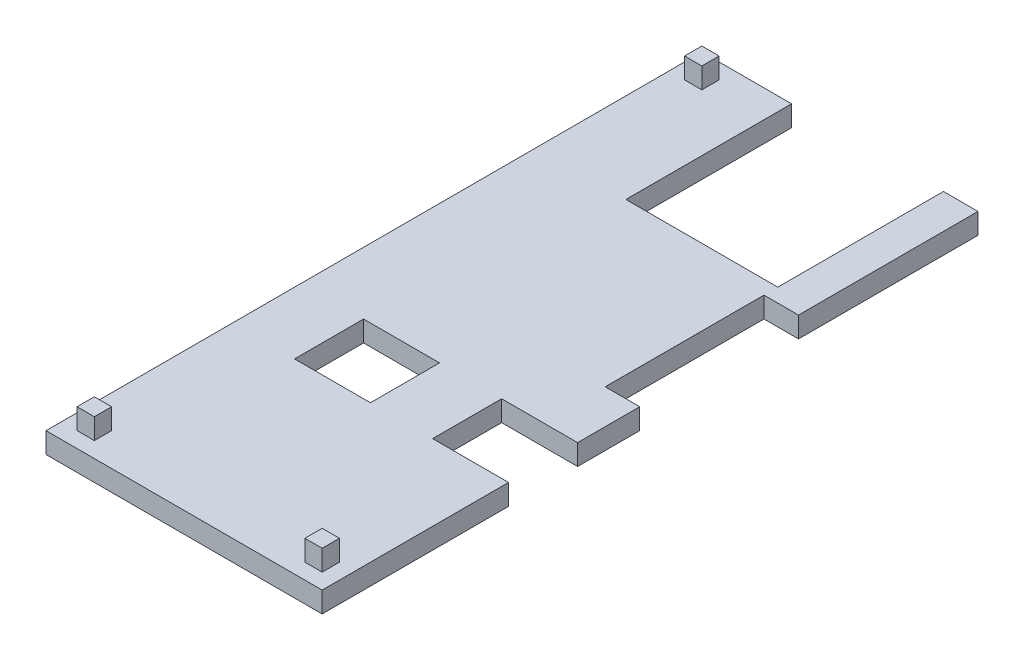
ISO-10303-21;
HEADER;
FILE_DESCRIPTION(('STEP AP214'),'2;1');
FILE_NAME('part.step','',(''),(''),'','','');
FILE_SCHEMA(('AUTOMOTIVE_DESIGN { 1 0 10303 214 1 1 1 1 }'));
ENDSEC;
DATA;
#1=APPLICATION_CONTEXT('core data for automotive mechanical design processes');
#2=APPLICATION_PROTOCOL_DEFINITION('international standard','automotive_design',2000,#1);
#3=PRODUCT_CONTEXT('',#1,'mechanical');
#4=PRODUCT('Part','Part','',(#3));
#5=PRODUCT_RELATED_PRODUCT_CATEGORY('part','',(#4));
#6=PRODUCT_DEFINITION_FORMATION('','',#4);
#7=PRODUCT_DEFINITION_CONTEXT('part definition',#1,'design');
#8=PRODUCT_DEFINITION('design','',#6,#7);
#9=PRODUCT_DEFINITION_SHAPE('','',#8);
#10=(LENGTH_UNIT() NAMED_UNIT(*) SI_UNIT(.MILLI.,.METRE.));
#11=(NAMED_UNIT(*) PLANE_ANGLE_UNIT() SI_UNIT($,.RADIAN.));
#12=(NAMED_UNIT(*) SI_UNIT($,.STERADIAN.) SOLID_ANGLE_UNIT());
#13=UNCERTAINTY_MEASURE_WITH_UNIT(LENGTH_MEASURE(1.E-05),#10,'distance_accuracy_value','');
#14=(GEOMETRIC_REPRESENTATION_CONTEXT(3) GLOBAL_UNCERTAINTY_ASSIGNED_CONTEXT((#13)) GLOBAL_UNIT_ASSIGNED_CONTEXT((#10,
#11,#12)) REPRESENTATION_CONTEXT('',''));
#15=CARTESIAN_POINT('',(0.,0.,0.));
#16=DIRECTION('',(0.,0.,1.));
#17=DIRECTION('',(1.,0.,0.));
#18=AXIS2_PLACEMENT_3D('',#15,#16,#17);
#19=CARTESIAN_POINT('',(0.,3.,0.));
#20=DIRECTION('',(0.,-1.,0.));
#21=DIRECTION('',(0.,0.,-1.));
#22=AXIS2_PLACEMENT_3D('',#19,#20,#21);
#23=PLANE('',#22);
#24=DIRECTION('',(0.,0.,-1.));
#25=VECTOR('',#24,1.);
#26=CARTESIAN_POINT('',(-20.,3.,0.));
#27=LINE('',#26,#25);
#28=CARTESIAN_POINT('',(-20.,3.,-27.));
#29=VERTEX_POINT('',#28);
#30=CARTESIAN_POINT('',(-20.,3.,-37.));
#31=VERTEX_POINT('',#30);
#32=EDGE_CURVE('E449',#29,#31,#27,.T.);
#33=ORIENTED_EDGE('',*,*,#32,.F.);
#34=DIRECTION('',(-1.,0.,0.));
#35=VECTOR('',#34,1.);
#36=CARTESIAN_POINT('',(0.,3.,-27.));
#37=LINE('',#36,#35);
#38=CARTESIAN_POINT('',(-31.,3.,-27.));
#39=VERTEX_POINT('',#38);
#40=EDGE_CURVE('E451',#29,#39,#37,.T.);
#41=ORIENTED_EDGE('',*,*,#40,.T.);
#42=DIRECTION('',(0.,0.,-1.));
#43=VECTOR('',#42,1.);
#44=CARTESIAN_POINT('',(-31.,3.,0.));
#45=LINE('',#44,#43);
#46=CARTESIAN_POINT('',(-31.,3.,-37.));
#47=VERTEX_POINT('',#46);
#48=EDGE_CURVE('E454',#39,#47,#45,.T.);
#49=ORIENTED_EDGE('',*,*,#48,.T.);
#50=DIRECTION('',(-1.,0.,0.));
#51=VECTOR('',#50,1.);
#52=CARTESIAN_POINT('',(0.,3.,-37.));
#53=LINE('',#52,#51);
#54=EDGE_CURVE('E457',#31,#47,#53,.T.);
#55=ORIENTED_EDGE('',*,*,#54,.F.);
#56=EDGE_LOOP('',(#33,#41,#49,#55));
#57=FACE_BOUND('',#56,.T.);
#58=DIRECTION('',(0.,0.,1.));
#59=VECTOR('',#58,1.);
#60=CARTESIAN_POINT('',(-37.75,3.,-4.75));
#61=LINE('',#60,#59);
#62=CARTESIAN_POINT('',(-37.75,3.,-4.75));
#63=VERTEX_POINT('',#62);
#64=CARTESIAN_POINT('',(-37.75,3.,-2.25));
#65=VERTEX_POINT('',#64);
#66=EDGE_CURVE('E352',#63,#65,#61,.T.);
#67=ORIENTED_EDGE('',*,*,#66,.F.);
#68=DIRECTION('',(-1.,0.,0.));
#69=VECTOR('',#68,1.);
#70=CARTESIAN_POINT('',(-37.75,3.,-4.75));
#71=LINE('',#70,#69);
#72=CARTESIAN_POINT('',(-35.25,3.,-4.75));
#73=VERTEX_POINT('',#72);
#74=EDGE_CURVE('E363',#73,#63,#71,.T.);
#75=ORIENTED_EDGE('',*,*,#74,.F.);
#76=DIRECTION('',(0.,0.,-1.));
#77=VECTOR('',#76,1.);
#78=CARTESIAN_POINT('',(-35.25,3.,-4.75));
#79=LINE('',#78,#77);
#80=CARTESIAN_POINT('',(-35.25,3.,-2.25));
#81=VERTEX_POINT('',#80);
#82=EDGE_CURVE('E376',#81,#73,#79,.T.);
#83=ORIENTED_EDGE('',*,*,#82,.F.);
#84=DIRECTION('',(1.,0.,0.));
#85=VECTOR('',#84,1.);
#86=CARTESIAN_POINT('',(-37.75,3.,-2.25));
#87=LINE('',#86,#85);
#88=EDGE_CURVE('E373',#65,#81,#87,.T.);
#89=ORIENTED_EDGE('',*,*,#88,.F.);
#90=EDGE_LOOP('',(#67,#75,#83,#89));
#91=FACE_BOUND('',#90,.T.);
#92=DIRECTION('',(0.,0.,1.));
#93=VECTOR('',#92,1.);
#94=CARTESIAN_POINT('',(-4.75,3.,-4.75));
#95=LINE('',#94,#93);
#96=CARTESIAN_POINT('',(-4.75,3.,-4.75));
#97=VERTEX_POINT('',#96);
#98=CARTESIAN_POINT('',(-4.75,3.,-2.25));
#99=VERTEX_POINT('',#98);
#100=EDGE_CURVE('E349',#97,#99,#95,.T.);
#101=ORIENTED_EDGE('',*,*,#100,.F.);
#102=DIRECTION('',(-1.,0.,0.));
#103=VECTOR('',#102,1.);
#104=CARTESIAN_POINT('',(-4.75,3.,-4.75));
#105=LINE('',#104,#103);
#106=CARTESIAN_POINT('',(-2.25,3.,-4.75));
#107=VERTEX_POINT('',#106);
#108=EDGE_CURVE('E339',#107,#97,#105,.T.);
#109=ORIENTED_EDGE('',*,*,#108,.F.);
#110=DIRECTION('',(0.,0.,-1.));
#111=VECTOR('',#110,1.);
#112=CARTESIAN_POINT('',(-2.25,3.,-4.75));
#113=LINE('',#112,#111);
#114=CARTESIAN_POINT('',(-2.25,3.,-2.25));
#115=VERTEX_POINT('',#114);
#116=EDGE_CURVE('E343',#115,#107,#113,.T.);
#117=ORIENTED_EDGE('',*,*,#116,.F.);
#118=DIRECTION('',(1.,0.,0.));
#119=VECTOR('',#118,1.);
#120=CARTESIAN_POINT('',(-4.75,3.,-2.25));
#121=LINE('',#120,#119);
#122=EDGE_CURVE('E346',#99,#115,#121,.T.);
#123=ORIENTED_EDGE('',*,*,#122,.F.);
#124=EDGE_LOOP('',(#101,#109,#117,#123));
#125=FACE_BOUND('',#124,.T.);
#126=DIRECTION('',(0.,0.,1.));
#127=VECTOR('',#126,1.);
#128=CARTESIAN_POINT('',(-37.75,3.,-90.25));
#129=LINE('',#128,#127);
#130=CARTESIAN_POINT('',(-37.75,3.,-92.75));
#131=VERTEX_POINT('',#130);
#132=CARTESIAN_POINT('',(-37.75,3.,-90.25));
#133=VERTEX_POINT('',#132);
#134=EDGE_CURVE('E392',#131,#133,#129,.T.);
#135=ORIENTED_EDGE('',*,*,#134,.F.);
#136=DIRECTION('',(-1.,0.,0.));
#137=VECTOR('',#136,1.);
#138=CARTESIAN_POINT('',(-37.75,3.,-92.75));
#139=LINE('',#138,#137);
#140=CARTESIAN_POINT('',(-35.25,3.,-92.75));
#141=VERTEX_POINT('',#140);
#142=EDGE_CURVE('E396',#141,#131,#139,.T.);
#143=ORIENTED_EDGE('',*,*,#142,.F.);
#144=DIRECTION('',(0.,0.,-1.));
#145=VECTOR('',#144,1.);
#146=CARTESIAN_POINT('',(-35.25,3.,-90.25));
#147=LINE('',#146,#145);
#148=CARTESIAN_POINT('',(-35.25,3.,-90.25));
#149=VERTEX_POINT('',#148);
#150=EDGE_CURVE('E409',#149,#141,#147,.T.);
#151=ORIENTED_EDGE('',*,*,#150,.F.);
#152=DIRECTION('',(1.,0.,0.));
#153=VECTOR('',#152,1.);
#154=CARTESIAN_POINT('',(-37.75,3.,-90.25));
#155=LINE('',#154,#153);
#156=EDGE_CURVE('E406',#133,#149,#155,.T.);
#157=ORIENTED_EDGE('',*,*,#156,.F.);
#158=EDGE_LOOP('',(#135,#143,#151,#157));
#159=FACE_BOUND('',#158,.T.);
#160=DIRECTION('',(0.,0.,-1.));
#161=VECTOR('',#160,1.);
#162=CARTESIAN_POINT('',(-4.99999999999999,3.,0.));
#163=LINE('',#162,#161);
#164=CARTESIAN_POINT('',(-5.,3.,-71.));
#165=VERTEX_POINT('',#164);
#166=CARTESIAN_POINT('',(-5.,3.,-95.));
#167=VERTEX_POINT('',#166);
#168=EDGE_CURVE('E253',#165,#167,#163,.T.);
#169=ORIENTED_EDGE('',*,*,#168,.F.);
#170=DIRECTION('',(-1.,0.,0.));
#171=VECTOR('',#170,1.);
#172=CARTESIAN_POINT('',(0.,3.,-71.));
#173=LINE('',#172,#171);
#174=CARTESIAN_POINT('',(-27.,3.,-71.));
#175=VERTEX_POINT('',#174);
#176=EDGE_CURVE('E426',#165,#175,#173,.T.);
#177=ORIENTED_EDGE('',*,*,#176,.T.);
#178=DIRECTION('',(0.,0.,-1.));
#179=VECTOR('',#178,1.);
#180=CARTESIAN_POINT('',(-27.,3.,0.));
#181=LINE('',#180,#179);
#182=CARTESIAN_POINT('',(-27.,3.,-95.));
#183=VERTEX_POINT('',#182);
#184=EDGE_CURVE('E429',#175,#183,#181,.T.);
#185=ORIENTED_EDGE('',*,*,#184,.T.);
#186=DIRECTION('',(-1.,0.,0.));
#187=VECTOR('',#186,1.);
#188=CARTESIAN_POINT('',(0.,3.,-95.));
#189=LINE('',#188,#187);
#190=CARTESIAN_POINT('',(-40.,3.,-95.));
#191=VERTEX_POINT('',#190);
#192=EDGE_CURVE('E290',#183,#191,#189,.T.);
#193=ORIENTED_EDGE('',*,*,#192,.T.);
#194=DIRECTION('',(0.,0.,-1.));
#195=VECTOR('',#194,1.);
#196=CARTESIAN_POINT('',(-40.,3.,0.));
#197=LINE('',#196,#195);
#198=CARTESIAN_POINT('',(-40.,3.,0.));
#199=VERTEX_POINT('',#198);
#200=EDGE_CURVE('E322',#199,#191,#197,.T.);
#201=ORIENTED_EDGE('',*,*,#200,.F.);
#202=DIRECTION('',(-1.,0.,0.));
#203=VECTOR('',#202,1.);
#204=CARTESIAN_POINT('',(0.,3.,0.));
#205=LINE('',#204,#203);
#206=CARTESIAN_POINT('',(0.,3.,0.));
#207=VERTEX_POINT('',#206);
#208=EDGE_CURVE('E300',#207,#199,#205,.T.);
#209=ORIENTED_EDGE('',*,*,#208,.F.);
#210=DIRECTION('',(0.,0.,-1.));
#211=VECTOR('',#210,1.);
#212=CARTESIAN_POINT('',(0.,3.,0.));
#213=LINE('',#212,#211);
#214=CARTESIAN_POINT('',(0.,3.,-27.));
#215=VERTEX_POINT('',#214);
#216=EDGE_CURVE('E281',#207,#215,#213,.T.);
#217=ORIENTED_EDGE('',*,*,#216,.T.);
#218=DIRECTION('',(1.,0.,0.));
#219=VECTOR('',#218,1.);
#220=CARTESIAN_POINT('',(0.,3.,-27.));
#221=LINE('',#220,#219);
#222=CARTESIAN_POINT('',(-11.,3.,-27.));
#223=VERTEX_POINT('',#222);
#224=EDGE_CURVE('E444',#223,#215,#221,.T.);
#225=ORIENTED_EDGE('',*,*,#224,.F.);
#226=DIRECTION('',(0.,0.,-1.));
#227=VECTOR('',#226,1.);
#228=CARTESIAN_POINT('',(-11.,3.,0.));
#229=LINE('',#228,#227);
#230=CARTESIAN_POINT('',(-11.,3.,-37.));
#231=VERTEX_POINT('',#230);
#232=EDGE_CURVE('E446',#223,#231,#229,.T.);
#233=ORIENTED_EDGE('',*,*,#232,.T.);
#234=DIRECTION('',(1.,0.,0.));
#235=VECTOR('',#234,1.);
#236=CARTESIAN_POINT('',(0.,3.,-37.));
#237=LINE('',#236,#235);
#238=CARTESIAN_POINT('',(0.,3.,-37.));
#239=VERTEX_POINT('',#238);
#240=EDGE_CURVE('E441',#231,#239,#237,.T.);
#241=ORIENTED_EDGE('',*,*,#240,.T.);
#242=CARTESIAN_POINT('',(0.,3.,-46.));
#243=VERTEX_POINT('',#242);
#244=EDGE_CURVE('E320',#239,#243,#213,.T.);
#245=ORIENTED_EDGE('',*,*,#244,.T.);
#246=DIRECTION('',(-1.,0.,0.));
#247=VECTOR('',#246,1.);
#248=CARTESIAN_POINT('',(0.,3.,-46.));
#249=LINE('',#248,#247);
#250=CARTESIAN_POINT('',(-5.,3.,-46.));
#251=VERTEX_POINT('',#250);
#252=EDGE_CURVE('E438',#243,#251,#249,.T.);
#253=ORIENTED_EDGE('',*,*,#252,.T.);
#254=DIRECTION('',(0.,0.,-1.));
#255=VECTOR('',#254,1.);
#256=CARTESIAN_POINT('',(-4.99999999999999,3.,0.));
#257=LINE('',#256,#255);
#258=CARTESIAN_POINT('',(-5.,3.,-69.));
#259=VERTEX_POINT('',#258);
#260=EDGE_CURVE('E432',#251,#259,#257,.T.);
#261=ORIENTED_EDGE('',*,*,#260,.T.);
#262=DIRECTION('',(1.,0.,0.));
#263=VECTOR('',#262,1.);
#264=CARTESIAN_POINT('',(0.,3.,-69.));
#265=LINE('',#264,#263);
#266=CARTESIAN_POINT('',(0.,3.,-69.));
#267=VERTEX_POINT('',#266);
#268=EDGE_CURVE('E435',#259,#267,#265,.T.);
#269=ORIENTED_EDGE('',*,*,#268,.T.);
#270=CARTESIAN_POINT('',(0.,3.,-95.));
#271=VERTEX_POINT('',#270);
#272=EDGE_CURVE('E321',#267,#271,#213,.T.);
#273=ORIENTED_EDGE('',*,*,#272,.T.);
#274=EDGE_CURVE('E323',#271,#167,#189,.T.);
#275=ORIENTED_EDGE('',*,*,#274,.T.);
#276=EDGE_LOOP('',(#169,#177,#185,#193,#201,#209,#217,#225,#233,#241,#245,#253,#261,#269,#273,#275));
#277=FACE_BOUND('',#276,.T.);
#278=ADVANCED_FACE('F37',(#57,#91,#125,#159,#277),#23,.F.);
#279=CARTESIAN_POINT('',(0.,3.,-95.));
#280=DIRECTION('',(0.,0.,1.));
#281=DIRECTION('',(1.,0.,0.));
#282=AXIS2_PLACEMENT_3D('',#279,#280,#281);
#283=PLANE('',#282);
#284=DIRECTION('',(0.,1.,0.));
#285=VECTOR('',#284,1.);
#286=CARTESIAN_POINT('',(-5.,0.,-95.));
#287=LINE('',#286,#285);
#288=CARTESIAN_POINT('',(-5.,0.,-95.));
#289=VERTEX_POINT('',#288);
#290=EDGE_CURVE('E247',#289,#167,#287,.T.);
#291=ORIENTED_EDGE('',*,*,#290,.T.);
#292=ORIENTED_EDGE('',*,*,#274,.F.);
#293=DIRECTION('',(0.,-1.,0.));
#294=VECTOR('',#293,1.);
#295=CARTESIAN_POINT('',(0.,3.,-95.));
#296=LINE('',#295,#294);
#297=CARTESIAN_POINT('',(0.,0.,-95.));
#298=VERTEX_POINT('',#297);
#299=EDGE_CURVE('E272',#271,#298,#296,.T.);
#300=ORIENTED_EDGE('',*,*,#299,.T.);
#301=DIRECTION('',(-1.,0.,0.));
#302=VECTOR('',#301,1.);
#303=CARTESIAN_POINT('',(0.,0.,-95.));
#304=LINE('',#303,#302);
#305=EDGE_CURVE('E264',#298,#289,#304,.T.);
#306=ORIENTED_EDGE('',*,*,#305,.T.);
#307=EDGE_LOOP('',(#291,#292,#300,#306));
#308=FACE_BOUND('',#307,.T.);
#309=ADVANCED_FACE('F270',(#308),#283,.F.);
#310=CARTESIAN_POINT('',(0.,3.,0.));
#311=DIRECTION('',(-1.,0.,0.));
#312=DIRECTION('',(0.,0.,1.));
#313=AXIS2_PLACEMENT_3D('',#310,#311,#312);
#314=PLANE('',#313);
#315=ORIENTED_EDGE('',*,*,#272,.F.);
#316=DIRECTION('',(0.,1.,0.));
#317=VECTOR('',#316,1.);
#318=CARTESIAN_POINT('',(0.,0.,-69.));
#319=LINE('',#318,#317);
#320=CARTESIAN_POINT('',(0.,0.,-69.));
#321=VERTEX_POINT('',#320);
#322=EDGE_CURVE('E503',#321,#267,#319,.T.);
#323=ORIENTED_EDGE('',*,*,#322,.F.);
#324=DIRECTION('',(0.,0.,-1.));
#325=VECTOR('',#324,1.);
#326=CARTESIAN_POINT('',(0.,0.,0.));
#327=LINE('',#326,#325);
#328=EDGE_CURVE('E286',#321,#298,#327,.T.);
#329=ORIENTED_EDGE('',*,*,#328,.T.);
#330=ORIENTED_EDGE('',*,*,#299,.F.);
#331=EDGE_LOOP('',(#315,#323,#329,#330));
#332=FACE_BOUND('',#331,.T.);
#333=ADVANCED_FACE('F528',(#332),#314,.F.);
#334=DIRECTION('',(0.,1.,0.));
#335=VECTOR('',#334,1.);
#336=CARTESIAN_POINT('',(0.,0.,-27.));
#337=LINE('',#336,#335);
#338=CARTESIAN_POINT('',(0.,0.,-27.));
#339=VERTEX_POINT('',#338);
#340=EDGE_CURVE('E316',#339,#215,#337,.T.);
#341=ORIENTED_EDGE('',*,*,#340,.T.);
#342=ORIENTED_EDGE('',*,*,#216,.F.);
#343=DIRECTION('',(0.,-1.,0.));
#344=VECTOR('',#343,1.);
#345=CARTESIAN_POINT('',(0.,3.,0.));
#346=LINE('',#345,#344);
#347=CARTESIAN_POINT('',(0.,0.,0.));
#348=VERTEX_POINT('',#347);
#349=EDGE_CURVE('E293',#207,#348,#346,.T.);
#350=ORIENTED_EDGE('',*,*,#349,.T.);
#351=EDGE_CURVE('E287',#348,#339,#327,.T.);
#352=ORIENTED_EDGE('',*,*,#351,.T.);
#353=EDGE_LOOP('',(#341,#342,#350,#352));
#354=FACE_BOUND('',#353,.T.);
#355=ADVANCED_FACE('F314',(#354),#314,.F.);
#356=CARTESIAN_POINT('',(0.,0.,0.));
#357=DIRECTION('',(0.,-1.,0.));
#358=DIRECTION('',(0.,0.,-1.));
#359=AXIS2_PLACEMENT_3D('',#356,#357,#358);
#360=PLANE('',#359);
#361=DIRECTION('',(1.,0.,0.));
#362=VECTOR('',#361,1.);
#363=CARTESIAN_POINT('',(0.,0.,-27.));
#364=LINE('',#363,#362);
#365=CARTESIAN_POINT('',(-31.,0.,-27.));
#366=VERTEX_POINT('',#365);
#367=CARTESIAN_POINT('',(-20.,0.,-27.));
#368=VERTEX_POINT('',#367);
#369=EDGE_CURVE('E462',#366,#368,#364,.T.);
#370=ORIENTED_EDGE('',*,*,#369,.T.);
#371=DIRECTION('',(0.,0.,1.));
#372=VECTOR('',#371,1.);
#373=CARTESIAN_POINT('',(-20.,0.,0.));
#374=LINE('',#373,#372);
#375=CARTESIAN_POINT('',(-20.,0.,-37.));
#376=VERTEX_POINT('',#375);
#377=EDGE_CURVE('E479',#376,#368,#374,.T.);
#378=ORIENTED_EDGE('',*,*,#377,.F.);
#379=DIRECTION('',(1.,0.,0.));
#380=VECTOR('',#379,1.);
#381=CARTESIAN_POINT('',(0.,0.,-37.));
#382=LINE('',#381,#380);
#383=CARTESIAN_POINT('',(-31.,0.,-37.));
#384=VERTEX_POINT('',#383);
#385=EDGE_CURVE('E477',#384,#376,#382,.T.);
#386=ORIENTED_EDGE('',*,*,#385,.F.);
#387=DIRECTION('',(0.,0.,1.));
#388=VECTOR('',#387,1.);
#389=CARTESIAN_POINT('',(-31.,0.,0.));
#390=LINE('',#389,#388);
#391=EDGE_CURVE('E474',#384,#366,#390,.T.);
#392=ORIENTED_EDGE('',*,*,#391,.T.);
#393=EDGE_LOOP('',(#370,#378,#386,#392));
#394=FACE_BOUND('',#393,.T.);
#395=DIRECTION('',(1.,0.,0.));
#396=VECTOR('',#395,1.);
#397=CARTESIAN_POINT('',(0.,0.,-71.));
#398=LINE('',#397,#396);
#399=CARTESIAN_POINT('',(-27.,0.,-71.));
#400=VERTEX_POINT('',#399);
#401=CARTESIAN_POINT('',(-5.,0.,-71.));
#402=VERTEX_POINT('',#401);
#403=EDGE_CURVE('E60',#400,#402,#398,.T.);
#404=ORIENTED_EDGE('',*,*,#403,.T.);
#405=DIRECTION('',(0.,0.,1.));
#406=VECTOR('',#405,1.);
#407=CARTESIAN_POINT('',(-4.99999999999999,0.,0.));
#408=LINE('',#407,#406);
#409=EDGE_CURVE('E251',#289,#402,#408,.T.);
#410=ORIENTED_EDGE('',*,*,#409,.F.);
#411=ORIENTED_EDGE('',*,*,#305,.F.);
#412=ORIENTED_EDGE('',*,*,#328,.F.);
#413=DIRECTION('',(-1.,0.,0.));
#414=VECTOR('',#413,1.);
#415=CARTESIAN_POINT('',(0.,0.,-69.));
#416=LINE('',#415,#414);
#417=CARTESIAN_POINT('',(-5.,0.,-69.));
#418=VERTEX_POINT('',#417);
#419=EDGE_CURVE('E500',#321,#418,#416,.T.);
#420=ORIENTED_EDGE('',*,*,#419,.T.);
#421=DIRECTION('',(0.,0.,1.));
#422=VECTOR('',#421,1.);
#423=CARTESIAN_POINT('',(-4.99999999999999,0.,0.));
#424=LINE('',#423,#422);
#425=CARTESIAN_POINT('',(-5.,0.,-46.));
#426=VERTEX_POINT('',#425);
#427=EDGE_CURVE('E490',#418,#426,#424,.T.);
#428=ORIENTED_EDGE('',*,*,#427,.T.);
#429=DIRECTION('',(1.,0.,0.));
#430=VECTOR('',#429,1.);
#431=CARTESIAN_POINT('',(0.,0.,-46.));
#432=LINE('',#431,#430);
#433=CARTESIAN_POINT('',(0.,0.,-46.));
#434=VERTEX_POINT('',#433);
#435=EDGE_CURVE('E509',#426,#434,#432,.T.);
#436=ORIENTED_EDGE('',*,*,#435,.T.);
#437=CARTESIAN_POINT('',(0.,0.,-37.));
#438=VERTEX_POINT('',#437);
#439=EDGE_CURVE('E291',#438,#434,#327,.T.);
#440=ORIENTED_EDGE('',*,*,#439,.F.);
#441=DIRECTION('',(-1.,0.,0.));
#442=VECTOR('',#441,1.);
#443=CARTESIAN_POINT('',(0.,0.,-37.));
#444=LINE('',#443,#442);
#445=CARTESIAN_POINT('',(-11.,0.,-37.));
#446=VERTEX_POINT('',#445);
#447=EDGE_CURVE('E471',#438,#446,#444,.T.);
#448=ORIENTED_EDGE('',*,*,#447,.T.);
#449=DIRECTION('',(0.,0.,1.));
#450=VECTOR('',#449,1.);
#451=CARTESIAN_POINT('',(-11.,0.,0.));
#452=LINE('',#451,#450);
#453=CARTESIAN_POINT('',(-11.,0.,-27.));
#454=VERTEX_POINT('',#453);
#455=EDGE_CURVE('E492',#446,#454,#452,.T.);
#456=ORIENTED_EDGE('',*,*,#455,.T.);
#457=DIRECTION('',(-1.,0.,0.));
#458=VECTOR('',#457,1.);
#459=CARTESIAN_POINT('',(0.,0.,-27.));
#460=LINE('',#459,#458);
#461=EDGE_CURVE('E311',#339,#454,#460,.T.);
#462=ORIENTED_EDGE('',*,*,#461,.F.);
#463=ORIENTED_EDGE('',*,*,#351,.F.);
#464=DIRECTION('',(-1.,0.,0.));
#465=VECTOR('',#464,1.);
#466=CARTESIAN_POINT('',(0.,0.,0.));
#467=LINE('',#466,#465);
#468=CARTESIAN_POINT('',(-40.,0.,0.));
#469=VERTEX_POINT('',#468);
#470=EDGE_CURVE('E277',#348,#469,#467,.T.);
#471=ORIENTED_EDGE('',*,*,#470,.T.);
#472=DIRECTION('',(0.,0.,-1.));
#473=VECTOR('',#472,1.);
#474=CARTESIAN_POINT('',(-40.,0.,0.));
#475=LINE('',#474,#473);
#476=CARTESIAN_POINT('',(-40.,0.,-95.));
#477=VERTEX_POINT('',#476);
#478=EDGE_CURVE('E273',#469,#477,#475,.T.);
#479=ORIENTED_EDGE('',*,*,#478,.T.);
#480=CARTESIAN_POINT('',(-27.,0.,-95.));
#481=VERTEX_POINT('',#480);
#482=EDGE_CURVE('E274',#481,#477,#304,.T.);
#483=ORIENTED_EDGE('',*,*,#482,.F.);
#484=DIRECTION('',(0.,0.,1.));
#485=VECTOR('',#484,1.);
#486=CARTESIAN_POINT('',(-27.,0.,0.));
#487=LINE('',#486,#485);
#488=EDGE_CURVE('E266',#481,#400,#487,.T.);
#489=ORIENTED_EDGE('',*,*,#488,.T.);
#490=EDGE_LOOP('',(#404,#410,#411,#412,#420,#428,#436,#440,#448,#456,#462,#463,#471,#479,#483,#489));
#491=FACE_BOUND('',#490,.T.);
#492=ADVANCED_FACE('F262',(#394,#491),#360,.T.);
#493=ORIENTED_EDGE('',*,*,#192,.F.);
#494=DIRECTION('',(0.,1.,0.));
#495=VECTOR('',#494,1.);
#496=CARTESIAN_POINT('',(-27.,0.,-95.));
#497=LINE('',#496,#495);
#498=EDGE_CURVE('E258',#481,#183,#497,.T.);
#499=ORIENTED_EDGE('',*,*,#498,.F.);
#500=ORIENTED_EDGE('',*,*,#482,.T.);
#501=DIRECTION('',(0.,-1.,0.));
#502=VECTOR('',#501,1.);
#503=CARTESIAN_POINT('',(-40.,3.,-95.));
#504=LINE('',#503,#502);
#505=EDGE_CURVE('E11',#191,#477,#504,.T.);
#506=ORIENTED_EDGE('',*,*,#505,.F.);
#507=EDGE_LOOP('',(#493,#499,#500,#506));
#508=FACE_BOUND('',#507,.T.);
#509=ADVANCED_FACE('F39',(#508),#283,.F.);
#510=CARTESIAN_POINT('',(-40.,3.,0.));
#511=DIRECTION('',(-1.,0.,0.));
#512=DIRECTION('',(0.,0.,1.));
#513=AXIS2_PLACEMENT_3D('',#510,#511,#512);
#514=PLANE('',#513);
#515=ORIENTED_EDGE('',*,*,#478,.F.);
#516=DIRECTION('',(0.,-1.,0.));
#517=VECTOR('',#516,1.);
#518=CARTESIAN_POINT('',(-40.,3.,0.));
#519=LINE('',#518,#517);
#520=EDGE_CURVE('E45',#199,#469,#519,.T.);
#521=ORIENTED_EDGE('',*,*,#520,.F.);
#522=ORIENTED_EDGE('',*,*,#200,.T.);
#523=ORIENTED_EDGE('',*,*,#505,.T.);
#524=EDGE_LOOP('',(#515,#521,#522,#523));
#525=FACE_BOUND('',#524,.T.);
#526=ADVANCED_FACE('F304',(#525),#514,.T.);
#527=CARTESIAN_POINT('',(0.,3.,0.));
#528=DIRECTION('',(0.,0.,1.));
#529=DIRECTION('',(1.,0.,0.));
#530=AXIS2_PLACEMENT_3D('',#527,#528,#529);
#531=PLANE('',#530);
#532=ORIENTED_EDGE('',*,*,#470,.F.);
#533=ORIENTED_EDGE('',*,*,#349,.F.);
#534=ORIENTED_EDGE('',*,*,#208,.T.);
#535=ORIENTED_EDGE('',*,*,#520,.T.);
#536=EDGE_LOOP('',(#532,#533,#534,#535));
#537=FACE_BOUND('',#536,.T.);
#538=ADVANCED_FACE('F298',(#537),#531,.T.);
#539=ORIENTED_EDGE('',*,*,#439,.T.);
#540=DIRECTION('',(0.,1.,0.));
#541=VECTOR('',#540,1.);
#542=CARTESIAN_POINT('',(0.,0.,-46.));
#543=LINE('',#542,#541);
#544=EDGE_CURVE('E499',#434,#243,#543,.T.);
#545=ORIENTED_EDGE('',*,*,#544,.T.);
#546=ORIENTED_EDGE('',*,*,#244,.F.);
#547=DIRECTION('',(0.,1.,0.));
#548=VECTOR('',#547,1.);
#549=CARTESIAN_POINT('',(0.,0.,-37.));
#550=LINE('',#549,#548);
#551=EDGE_CURVE('E488',#438,#239,#550,.T.);
#552=ORIENTED_EDGE('',*,*,#551,.F.);
#553=EDGE_LOOP('',(#539,#545,#546,#552));
#554=FACE_BOUND('',#553,.T.);
#555=ADVANCED_FACE('F533',(#554),#314,.F.);
#556=CARTESIAN_POINT('',(-4.75,6.,-4.75));
#557=DIRECTION('',(1.,0.,0.));
#558=DIRECTION('',(0.,0.,-1.));
#559=AXIS2_PLACEMENT_3D('',#556,#557,#558);
#560=PLANE('',#559);
#561=ORIENTED_EDGE('',*,*,#100,.T.);
#562=DIRECTION('',(0.,-1.,0.));
#563=VECTOR('',#562,1.);
#564=CARTESIAN_POINT('',(-4.75,6.,-2.25));
#565=LINE('',#564,#563);
#566=CARTESIAN_POINT('',(-4.75,6.,-2.25));
#567=VERTEX_POINT('',#566);
#568=EDGE_CURVE('E279',#567,#99,#565,.T.);
#569=ORIENTED_EDGE('',*,*,#568,.F.);
#570=DIRECTION('',(0.,0.,1.));
#571=VECTOR('',#570,1.);
#572=CARTESIAN_POINT('',(-4.75,6.,-4.75));
#573=LINE('',#572,#571);
#574=CARTESIAN_POINT('',(-4.75,6.,-4.75));
#575=VERTEX_POINT('',#574);
#576=EDGE_CURVE('E342',#575,#567,#573,.T.);
#577=ORIENTED_EDGE('',*,*,#576,.F.);
#578=DIRECTION('',(0.,-1.,0.));
#579=VECTOR('',#578,1.);
#580=CARTESIAN_POINT('',(-4.75,6.,-4.75));
#581=LINE('',#580,#579);
#582=EDGE_CURVE('E335',#575,#97,#581,.T.);
#583=ORIENTED_EDGE('',*,*,#582,.T.);
#584=EDGE_LOOP('',(#561,#569,#577,#583));
#585=FACE_BOUND('',#584,.T.);
#586=ADVANCED_FACE('F568',(#585),#560,.F.);
#587=CARTESIAN_POINT('',(-4.75,6.,-2.25));
#588=DIRECTION('',(0.,0.,-1.));
#589=DIRECTION('',(-1.,0.,0.));
#590=AXIS2_PLACEMENT_3D('',#587,#588,#589);
#591=PLANE('',#590);
#592=ORIENTED_EDGE('',*,*,#122,.T.);
#593=DIRECTION('',(0.,-1.,0.));
#594=VECTOR('',#593,1.);
#595=CARTESIAN_POINT('',(-2.25,6.,-2.25));
#596=LINE('',#595,#594);
#597=CARTESIAN_POINT('',(-2.25,6.,-2.25));
#598=VERTEX_POINT('',#597);
#599=EDGE_CURVE('E329',#598,#115,#596,.T.);
#600=ORIENTED_EDGE('',*,*,#599,.F.);
#601=DIRECTION('',(1.,0.,0.));
#602=VECTOR('',#601,1.);
#603=CARTESIAN_POINT('',(-4.75,6.,-2.25));
#604=LINE('',#603,#602);
#605=EDGE_CURVE('E356',#567,#598,#604,.T.);
#606=ORIENTED_EDGE('',*,*,#605,.F.);
#607=ORIENTED_EDGE('',*,*,#568,.T.);
#608=EDGE_LOOP('',(#592,#600,#606,#607));
#609=FACE_BOUND('',#608,.T.);
#610=ADVANCED_FACE('F752',(#609),#591,.F.);
#611=CARTESIAN_POINT('',(-2.25,6.,-4.75));
#612=DIRECTION('',(-1.,0.,0.));
#613=DIRECTION('',(0.,0.,1.));
#614=AXIS2_PLACEMENT_3D('',#611,#612,#613);
#615=PLANE('',#614);
#616=ORIENTED_EDGE('',*,*,#116,.T.);
#617=DIRECTION('',(0.,-1.,0.));
#618=VECTOR('',#617,1.);
#619=CARTESIAN_POINT('',(-2.25,6.,-4.75));
#620=LINE('',#619,#618);
#621=CARTESIAN_POINT('',(-2.25,6.,-4.75));
#622=VERTEX_POINT('',#621);
#623=EDGE_CURVE('E332',#622,#107,#620,.T.);
#624=ORIENTED_EDGE('',*,*,#623,.F.);
#625=DIRECTION('',(0.,0.,-1.));
#626=VECTOR('',#625,1.);
#627=CARTESIAN_POINT('',(-2.25,6.,-4.75));
#628=LINE('',#627,#626);
#629=EDGE_CURVE('E354',#598,#622,#628,.T.);
#630=ORIENTED_EDGE('',*,*,#629,.F.);
#631=ORIENTED_EDGE('',*,*,#599,.T.);
#632=EDGE_LOOP('',(#616,#624,#630,#631));
#633=FACE_BOUND('',#632,.T.);
#634=ADVANCED_FACE('F741',(#633),#615,.F.);
#635=CARTESIAN_POINT('',(-4.75,6.,-4.75));
#636=DIRECTION('',(0.,0.,1.));
#637=DIRECTION('',(1.,0.,0.));
#638=AXIS2_PLACEMENT_3D('',#635,#636,#637);
#639=PLANE('',#638);
#640=ORIENTED_EDGE('',*,*,#108,.T.);
#641=ORIENTED_EDGE('',*,*,#582,.F.);
#642=DIRECTION('',(-1.,0.,0.));
#643=VECTOR('',#642,1.);
#644=CARTESIAN_POINT('',(-4.75,6.,-4.75));
#645=LINE('',#644,#643);
#646=EDGE_CURVE('E338',#622,#575,#645,.T.);
#647=ORIENTED_EDGE('',*,*,#646,.F.);
#648=ORIENTED_EDGE('',*,*,#623,.T.);
#649=EDGE_LOOP('',(#640,#641,#647,#648));
#650=FACE_BOUND('',#649,.T.);
#651=ADVANCED_FACE('F730',(#650),#639,.F.);
#652=CARTESIAN_POINT('',(0.,6.,0.));
#653=DIRECTION('',(0.,1.,0.));
#654=DIRECTION('',(0.,0.,1.));
#655=AXIS2_PLACEMENT_3D('',#652,#653,#654);
#656=PLANE('',#655);
#657=ORIENTED_EDGE('',*,*,#576,.T.);
#658=ORIENTED_EDGE('',*,*,#605,.T.);
#659=ORIENTED_EDGE('',*,*,#629,.T.);
#660=ORIENTED_EDGE('',*,*,#646,.T.);
#661=EDGE_LOOP('',(#657,#658,#659,#660));
#662=FACE_BOUND('',#661,.T.);
#663=ADVANCED_FACE('F719',(#662),#656,.T.);
#664=CARTESIAN_POINT('',(-37.75,6.,-4.75));
#665=DIRECTION('',(1.,0.,0.));
#666=DIRECTION('',(0.,0.,-1.));
#667=AXIS2_PLACEMENT_3D('',#664,#665,#666);
#668=PLANE('',#667);
#669=ORIENTED_EDGE('',*,*,#66,.T.);
#670=DIRECTION('',(0.,-1.,0.));
#671=VECTOR('',#670,1.);
#672=CARTESIAN_POINT('',(-37.75,6.,-2.25));
#673=LINE('',#672,#671);
#674=CARTESIAN_POINT('',(-37.75,6.,-2.25));
#675=VERTEX_POINT('',#674);
#676=EDGE_CURVE('E389',#675,#65,#673,.T.);
#677=ORIENTED_EDGE('',*,*,#676,.F.);
#678=DIRECTION('',(0.,0.,1.));
#679=VECTOR('',#678,1.);
#680=CARTESIAN_POINT('',(-37.75,6.,-4.75));
#681=LINE('',#680,#679);
#682=CARTESIAN_POINT('',(-37.75,6.,-4.75));
#683=VERTEX_POINT('',#682);
#684=EDGE_CURVE('E360',#683,#675,#681,.T.);
#685=ORIENTED_EDGE('',*,*,#684,.F.);
#686=DIRECTION('',(0.,-1.,0.));
#687=VECTOR('',#686,1.);
#688=CARTESIAN_POINT('',(-37.75,6.,-4.75));
#689=LINE('',#688,#687);
#690=EDGE_CURVE('E370',#683,#63,#689,.T.);
#691=ORIENTED_EDGE('',*,*,#690,.T.);
#692=EDGE_LOOP('',(#669,#677,#685,#691));
#693=FACE_BOUND('',#692,.T.);
#694=ADVANCED_FACE('F708',(#693),#668,.F.);
#695=CARTESIAN_POINT('',(-37.75,6.,-2.25));
#696=DIRECTION('',(0.,0.,-1.));
#697=DIRECTION('',(-1.,0.,0.));
#698=AXIS2_PLACEMENT_3D('',#695,#696,#697);
#699=PLANE('',#698);
#700=ORIENTED_EDGE('',*,*,#88,.T.);
#701=DIRECTION('',(0.,-1.,0.));
#702=VECTOR('',#701,1.);
#703=CARTESIAN_POINT('',(-35.25,6.,-2.25));
#704=LINE('',#703,#702);
#705=CARTESIAN_POINT('',(-35.25,6.,-2.25));
#706=VERTEX_POINT('',#705);
#707=EDGE_CURVE('E386',#706,#81,#704,.T.);
#708=ORIENTED_EDGE('',*,*,#707,.F.);
#709=DIRECTION('',(1.,0.,0.));
#710=VECTOR('',#709,1.);
#711=CARTESIAN_POINT('',(-37.75,6.,-2.25));
#712=LINE('',#711,#710);
#713=EDGE_CURVE('E364',#675,#706,#712,.T.);
#714=ORIENTED_EDGE('',*,*,#713,.F.);
#715=ORIENTED_EDGE('',*,*,#676,.T.);
#716=EDGE_LOOP('',(#700,#708,#714,#715));
#717=FACE_BOUND('',#716,.T.);
#718=ADVANCED_FACE('F697',(#717),#699,.F.);
#719=CARTESIAN_POINT('',(-35.25,6.,-4.75));
#720=DIRECTION('',(-1.,0.,0.));
#721=DIRECTION('',(0.,0.,1.));
#722=AXIS2_PLACEMENT_3D('',#719,#720,#721);
#723=PLANE('',#722);
#724=ORIENTED_EDGE('',*,*,#82,.T.);
#725=DIRECTION('',(0.,-1.,0.));
#726=VECTOR('',#725,1.);
#727=CARTESIAN_POINT('',(-35.25,6.,-4.75));
#728=LINE('',#727,#726);
#729=CARTESIAN_POINT('',(-35.25,6.,-4.75));
#730=VERTEX_POINT('',#729);
#731=EDGE_CURVE('E383',#730,#73,#728,.T.);
#732=ORIENTED_EDGE('',*,*,#731,.F.);
#733=DIRECTION('',(0.,0.,-1.));
#734=VECTOR('',#733,1.);
#735=CARTESIAN_POINT('',(-35.25,6.,-4.75));
#736=LINE('',#735,#734);
#737=EDGE_CURVE('E366',#706,#730,#736,.T.);
#738=ORIENTED_EDGE('',*,*,#737,.F.);
#739=ORIENTED_EDGE('',*,*,#707,.T.);
#740=EDGE_LOOP('',(#724,#732,#738,#739));
#741=FACE_BOUND('',#740,.T.);
#742=ADVANCED_FACE('F686',(#741),#723,.F.);
#743=CARTESIAN_POINT('',(-37.75,6.,-4.75));
#744=DIRECTION('',(0.,0.,1.));
#745=DIRECTION('',(1.,0.,0.));
#746=AXIS2_PLACEMENT_3D('',#743,#744,#745);
#747=PLANE('',#746);
#748=ORIENTED_EDGE('',*,*,#74,.T.);
#749=ORIENTED_EDGE('',*,*,#690,.F.);
#750=DIRECTION('',(-1.,0.,0.));
#751=VECTOR('',#750,1.);
#752=CARTESIAN_POINT('',(-37.75,6.,-4.75));
#753=LINE('',#752,#751);
#754=EDGE_CURVE('E368',#730,#683,#753,.T.);
#755=ORIENTED_EDGE('',*,*,#754,.F.);
#756=ORIENTED_EDGE('',*,*,#731,.T.);
#757=EDGE_LOOP('',(#748,#749,#755,#756));
#758=FACE_BOUND('',#757,.T.);
#759=ADVANCED_FACE('F675',(#758),#747,.F.);
#760=CARTESIAN_POINT('',(0.,6.,0.));
#761=DIRECTION('',(0.,1.,0.));
#762=DIRECTION('',(0.,0.,1.));
#763=AXIS2_PLACEMENT_3D('',#760,#761,#762);
#764=PLANE('',#763);
#765=ORIENTED_EDGE('',*,*,#684,.T.);
#766=ORIENTED_EDGE('',*,*,#713,.T.);
#767=ORIENTED_EDGE('',*,*,#737,.T.);
#768=ORIENTED_EDGE('',*,*,#754,.T.);
#769=EDGE_LOOP('',(#765,#766,#767,#768));
#770=FACE_BOUND('',#769,.T.);
#771=ADVANCED_FACE('F664',(#770),#764,.T.);
#772=CARTESIAN_POINT('',(-37.75,6.,-90.25));
#773=DIRECTION('',(1.,0.,0.));
#774=DIRECTION('',(0.,0.,-1.));
#775=AXIS2_PLACEMENT_3D('',#772,#773,#774);
#776=PLANE('',#775);
#777=ORIENTED_EDGE('',*,*,#134,.T.);
#778=DIRECTION('',(0.,-1.,0.));
#779=VECTOR('',#778,1.);
#780=CARTESIAN_POINT('',(-37.75,6.,-90.25));
#781=LINE('',#780,#779);
#782=CARTESIAN_POINT('',(-37.75,6.,-90.25));
#783=VERTEX_POINT('',#782);
#784=EDGE_CURVE('E422',#783,#133,#781,.T.);
#785=ORIENTED_EDGE('',*,*,#784,.F.);
#786=DIRECTION('',(0.,0.,1.));
#787=VECTOR('',#786,1.);
#788=CARTESIAN_POINT('',(-37.75,6.,-90.25));
#789=LINE('',#788,#787);
#790=CARTESIAN_POINT('',(-37.75,6.,-92.75));
#791=VERTEX_POINT('',#790);
#792=EDGE_CURVE('E393',#791,#783,#789,.T.);
#793=ORIENTED_EDGE('',*,*,#792,.F.);
#794=DIRECTION('',(0.,-1.,0.));
#795=VECTOR('',#794,1.);
#796=CARTESIAN_POINT('',(-37.75,6.,-92.75));
#797=LINE('',#796,#795);
#798=EDGE_CURVE('E403',#791,#131,#797,.T.);
#799=ORIENTED_EDGE('',*,*,#798,.T.);
#800=EDGE_LOOP('',(#777,#785,#793,#799));
#801=FACE_BOUND('',#800,.T.);
#802=ADVANCED_FACE('F653',(#801),#776,.F.);
#803=CARTESIAN_POINT('',(-37.75,6.,-90.25));
#804=DIRECTION('',(0.,0.,-1.));
#805=DIRECTION('',(-1.,0.,0.));
#806=AXIS2_PLACEMENT_3D('',#803,#804,#805);
#807=PLANE('',#806);
#808=ORIENTED_EDGE('',*,*,#156,.T.);
#809=DIRECTION('',(0.,-1.,0.));
#810=VECTOR('',#809,1.);
#811=CARTESIAN_POINT('',(-35.25,6.,-90.25));
#812=LINE('',#811,#810);
#813=CARTESIAN_POINT('',(-35.25,6.,-90.25));
#814=VERTEX_POINT('',#813);
#815=EDGE_CURVE('E419',#814,#149,#812,.T.);
#816=ORIENTED_EDGE('',*,*,#815,.F.);
#817=DIRECTION('',(1.,0.,0.));
#818=VECTOR('',#817,1.);
#819=CARTESIAN_POINT('',(-37.75,6.,-90.25));
#820=LINE('',#819,#818);
#821=EDGE_CURVE('E397',#783,#814,#820,.T.);
#822=ORIENTED_EDGE('',*,*,#821,.F.);
#823=ORIENTED_EDGE('',*,*,#784,.T.);
#824=EDGE_LOOP('',(#808,#816,#822,#823));
#825=FACE_BOUND('',#824,.T.);
#826=ADVANCED_FACE('F642',(#825),#807,.F.);
#827=CARTESIAN_POINT('',(-35.25,6.,-90.25));
#828=DIRECTION('',(-1.,0.,0.));
#829=DIRECTION('',(0.,0.,1.));
#830=AXIS2_PLACEMENT_3D('',#827,#828,#829);
#831=PLANE('',#830);
#832=ORIENTED_EDGE('',*,*,#150,.T.);
#833=DIRECTION('',(0.,-1.,0.));
#834=VECTOR('',#833,1.);
#835=CARTESIAN_POINT('',(-35.25,6.,-92.75));
#836=LINE('',#835,#834);
#837=CARTESIAN_POINT('',(-35.25,6.,-92.75));
#838=VERTEX_POINT('',#837);
#839=EDGE_CURVE('E416',#838,#141,#836,.T.);
#840=ORIENTED_EDGE('',*,*,#839,.F.);
#841=DIRECTION('',(0.,0.,-1.));
#842=VECTOR('',#841,1.);
#843=CARTESIAN_POINT('',(-35.25,6.,-90.25));
#844=LINE('',#843,#842);
#845=EDGE_CURVE('E399',#814,#838,#844,.T.);
#846=ORIENTED_EDGE('',*,*,#845,.F.);
#847=ORIENTED_EDGE('',*,*,#815,.T.);
#848=EDGE_LOOP('',(#832,#840,#846,#847));
#849=FACE_BOUND('',#848,.T.);
#850=ADVANCED_FACE('F631',(#849),#831,.F.);
#851=CARTESIAN_POINT('',(-37.75,6.,-92.75));
#852=DIRECTION('',(0.,0.,1.));
#853=DIRECTION('',(1.,0.,0.));
#854=AXIS2_PLACEMENT_3D('',#851,#852,#853);
#855=PLANE('',#854);
#856=ORIENTED_EDGE('',*,*,#142,.T.);
#857=ORIENTED_EDGE('',*,*,#798,.F.);
#858=DIRECTION('',(-1.,0.,0.));
#859=VECTOR('',#858,1.);
#860=CARTESIAN_POINT('',(-37.75,6.,-92.75));
#861=LINE('',#860,#859);
#862=EDGE_CURVE('E401',#838,#791,#861,.T.);
#863=ORIENTED_EDGE('',*,*,#862,.F.);
#864=ORIENTED_EDGE('',*,*,#839,.T.);
#865=EDGE_LOOP('',(#856,#857,#863,#864));
#866=FACE_BOUND('',#865,.T.);
#867=ADVANCED_FACE('F619',(#866),#855,.F.);
#868=CARTESIAN_POINT('',(0.,6.,0.));
#869=DIRECTION('',(0.,-1.,0.));
#870=DIRECTION('',(0.,0.,-1.));
#871=AXIS2_PLACEMENT_3D('',#868,#869,#870);
#872=PLANE('',#871);
#873=ORIENTED_EDGE('',*,*,#792,.T.);
#874=ORIENTED_EDGE('',*,*,#821,.T.);
#875=ORIENTED_EDGE('',*,*,#845,.T.);
#876=ORIENTED_EDGE('',*,*,#862,.T.);
#877=EDGE_LOOP('',(#873,#874,#875,#876));
#878=FACE_BOUND('',#877,.T.);
#879=ADVANCED_FACE('F613',(#878),#872,.F.);
#880=CARTESIAN_POINT('',(-20.,0.,0.));
#881=DIRECTION('',(-1.,0.,0.));
#882=DIRECTION('',(0.,0.,1.));
#883=AXIS2_PLACEMENT_3D('',#880,#881,#882);
#884=PLANE('',#883);
#885=ORIENTED_EDGE('',*,*,#32,.T.);
#886=DIRECTION('',(0.,1.,0.));
#887=VECTOR('',#886,1.);
#888=CARTESIAN_POINT('',(-20.,0.,-37.));
#889=LINE('',#888,#887);
#890=EDGE_CURVE('E52',#376,#31,#889,.T.);
#891=ORIENTED_EDGE('',*,*,#890,.F.);
#892=ORIENTED_EDGE('',*,*,#377,.T.);
#893=DIRECTION('',(0.,1.,0.));
#894=VECTOR('',#893,1.);
#895=CARTESIAN_POINT('',(-20.,0.,-27.));
#896=LINE('',#895,#894);
#897=EDGE_CURVE('E468',#368,#29,#896,.T.);
#898=ORIENTED_EDGE('',*,*,#897,.T.);
#899=EDGE_LOOP('',(#885,#891,#892,#898));
#900=FACE_BOUND('',#899,.T.);
#901=ADVANCED_FACE('F618',(#900),#884,.T.);
#902=CARTESIAN_POINT('',(0.,0.,-27.));
#903=DIRECTION('',(0.,0.,1.));
#904=DIRECTION('',(1.,0.,0.));
#905=AXIS2_PLACEMENT_3D('',#902,#903,#904);
#906=PLANE('',#905);
#907=ORIENTED_EDGE('',*,*,#897,.F.);
#908=ORIENTED_EDGE('',*,*,#369,.F.);
#909=DIRECTION('',(0.,1.,0.));
#910=VECTOR('',#909,1.);
#911=CARTESIAN_POINT('',(-31.,0.,-27.));
#912=LINE('',#911,#910);
#913=EDGE_CURVE('E465',#366,#39,#912,.T.);
#914=ORIENTED_EDGE('',*,*,#913,.T.);
#915=ORIENTED_EDGE('',*,*,#40,.F.);
#916=EDGE_LOOP('',(#907,#908,#914,#915));
#917=FACE_BOUND('',#916,.T.);
#918=ADVANCED_FACE('F832',(#917),#906,.F.);
#919=CARTESIAN_POINT('',(-31.,0.,0.));
#920=DIRECTION('',(-1.,0.,0.));
#921=DIRECTION('',(0.,0.,1.));
#922=AXIS2_PLACEMENT_3D('',#919,#920,#921);
#923=PLANE('',#922);
#924=ORIENTED_EDGE('',*,*,#913,.F.);
#925=ORIENTED_EDGE('',*,*,#391,.F.);
#926=DIRECTION('',(0.,1.,0.));
#927=VECTOR('',#926,1.);
#928=CARTESIAN_POINT('',(-31.,0.,-37.));
#929=LINE('',#928,#927);
#930=EDGE_CURVE('E461',#384,#47,#929,.T.);
#931=ORIENTED_EDGE('',*,*,#930,.T.);
#932=ORIENTED_EDGE('',*,*,#48,.F.);
#933=EDGE_LOOP('',(#924,#925,#931,#932));
#934=FACE_BOUND('',#933,.T.);
#935=ADVANCED_FACE('F842',(#934),#923,.F.);
#936=CARTESIAN_POINT('',(0.,0.,-37.));
#937=DIRECTION('',(0.,0.,1.));
#938=DIRECTION('',(1.,0.,0.));
#939=AXIS2_PLACEMENT_3D('',#936,#937,#938);
#940=PLANE('',#939);
#941=ORIENTED_EDGE('',*,*,#54,.T.);
#942=ORIENTED_EDGE('',*,*,#930,.F.);
#943=ORIENTED_EDGE('',*,*,#385,.T.);
#944=ORIENTED_EDGE('',*,*,#890,.T.);
#945=EDGE_LOOP('',(#941,#942,#943,#944));
#946=FACE_BOUND('',#945,.T.);
#947=ADVANCED_FACE('F555',(#946),#940,.T.);
#948=CARTESIAN_POINT('',(0.,0.,-37.));
#949=DIRECTION('',(0.,0.,-1.));
#950=DIRECTION('',(-1.,0.,0.));
#951=AXIS2_PLACEMENT_3D('',#948,#949,#950);
#952=PLANE('',#951);
#953=DIRECTION('',(0.,1.,0.));
#954=VECTOR('',#953,1.);
#955=CARTESIAN_POINT('',(-11.,0.,-37.));
#956=LINE('',#955,#954);
#957=EDGE_CURVE('E481',#446,#231,#956,.T.);
#958=ORIENTED_EDGE('',*,*,#957,.F.);
#959=ORIENTED_EDGE('',*,*,#447,.F.);
#960=ORIENTED_EDGE('',*,*,#551,.T.);
#961=ORIENTED_EDGE('',*,*,#240,.F.);
#962=EDGE_LOOP('',(#958,#959,#960,#961));
#963=FACE_BOUND('',#962,.T.);
#964=ADVANCED_FACE('F541',(#963),#952,.F.);
#965=CARTESIAN_POINT('',(0.,0.,-27.));
#966=DIRECTION('',(0.,0.,-1.));
#967=DIRECTION('',(-1.,0.,0.));
#968=AXIS2_PLACEMENT_3D('',#965,#966,#967);
#969=PLANE('',#968);
#970=ORIENTED_EDGE('',*,*,#224,.T.);
#971=ORIENTED_EDGE('',*,*,#340,.F.);
#972=ORIENTED_EDGE('',*,*,#461,.T.);
#973=DIRECTION('',(0.,1.,0.));
#974=VECTOR('',#973,1.);
#975=CARTESIAN_POINT('',(-11.,0.,-27.));
#976=LINE('',#975,#974);
#977=EDGE_CURVE('E484',#454,#223,#976,.T.);
#978=ORIENTED_EDGE('',*,*,#977,.T.);
#979=EDGE_LOOP('',(#970,#971,#972,#978));
#980=FACE_BOUND('',#979,.T.);
#981=ADVANCED_FACE('F546',(#980),#969,.T.);
#982=CARTESIAN_POINT('',(-11.,0.,0.));
#983=DIRECTION('',(-1.,0.,0.));
#984=DIRECTION('',(0.,0.,1.));
#985=AXIS2_PLACEMENT_3D('',#982,#983,#984);
#986=PLANE('',#985);
#987=ORIENTED_EDGE('',*,*,#977,.F.);
#988=ORIENTED_EDGE('',*,*,#455,.F.);
#989=ORIENTED_EDGE('',*,*,#957,.T.);
#990=ORIENTED_EDGE('',*,*,#232,.F.);
#991=EDGE_LOOP('',(#987,#988,#989,#990));
#992=FACE_BOUND('',#991,.T.);
#993=ADVANCED_FACE('F544',(#992),#986,.F.);
#994=CARTESIAN_POINT('',(-4.99999999999999,0.,0.));
#995=DIRECTION('',(-1.,0.,0.));
#996=DIRECTION('',(0.,0.,1.));
#997=AXIS2_PLACEMENT_3D('',#994,#995,#996);
#998=PLANE('',#997);
#999=DIRECTION('',(0.,1.,0.));
#1000=VECTOR('',#999,1.);
#1001=CARTESIAN_POINT('',(-5.,0.,-46.));
#1002=LINE('',#1001,#1000);
#1003=EDGE_CURVE('E496',#426,#251,#1002,.T.);
#1004=ORIENTED_EDGE('',*,*,#1003,.F.);
#1005=ORIENTED_EDGE('',*,*,#427,.F.);
#1006=DIRECTION('',(0.,1.,0.));
#1007=VECTOR('',#1006,1.);
#1008=CARTESIAN_POINT('',(-5.,0.,-69.));
#1009=LINE('',#1008,#1007);
#1010=EDGE_CURVE('E267',#418,#259,#1009,.T.);
#1011=ORIENTED_EDGE('',*,*,#1010,.T.);
#1012=ORIENTED_EDGE('',*,*,#260,.F.);
#1013=EDGE_LOOP('',(#1004,#1005,#1011,#1012));
#1014=FACE_BOUND('',#1013,.T.);
#1015=ADVANCED_FACE('F553',(#1014),#998,.F.);
#1016=CARTESIAN_POINT('',(0.,0.,-69.));
#1017=DIRECTION('',(0.,0.,-1.));
#1018=DIRECTION('',(-1.,0.,0.));
#1019=AXIS2_PLACEMENT_3D('',#1016,#1017,#1018);
#1020=PLANE('',#1019);
#1021=ORIENTED_EDGE('',*,*,#1010,.F.);
#1022=ORIENTED_EDGE('',*,*,#419,.F.);
#1023=ORIENTED_EDGE('',*,*,#322,.T.);
#1024=ORIENTED_EDGE('',*,*,#268,.F.);
#1025=EDGE_LOOP('',(#1021,#1022,#1023,#1024));
#1026=FACE_BOUND('',#1025,.T.);
#1027=ADVANCED_FACE('F891',(#1026),#1020,.F.);
#1028=CARTESIAN_POINT('',(0.,0.,-46.));
#1029=DIRECTION('',(0.,0.,1.));
#1030=DIRECTION('',(1.,0.,0.));
#1031=AXIS2_PLACEMENT_3D('',#1028,#1029,#1030);
#1032=PLANE('',#1031);
#1033=ORIENTED_EDGE('',*,*,#544,.F.);
#1034=ORIENTED_EDGE('',*,*,#435,.F.);
#1035=ORIENTED_EDGE('',*,*,#1003,.T.);
#1036=ORIENTED_EDGE('',*,*,#252,.F.);
#1037=EDGE_LOOP('',(#1033,#1034,#1035,#1036));
#1038=FACE_BOUND('',#1037,.T.);
#1039=ADVANCED_FACE('F539',(#1038),#1032,.F.);
#1040=CARTESIAN_POINT('',(-4.99999999999999,0.,0.));
#1041=DIRECTION('',(-1.,0.,0.));
#1042=DIRECTION('',(0.,0.,1.));
#1043=AXIS2_PLACEMENT_3D('',#1040,#1041,#1042);
#1044=PLANE('',#1043);
#1045=ORIENTED_EDGE('',*,*,#168,.T.);
#1046=ORIENTED_EDGE('',*,*,#290,.F.);
#1047=ORIENTED_EDGE('',*,*,#409,.T.);
#1048=DIRECTION('',(0.,1.,0.));
#1049=VECTOR('',#1048,1.);
#1050=CARTESIAN_POINT('',(-5.,0.,-71.));
#1051=LINE('',#1050,#1049);
#1052=EDGE_CURVE('E459',#402,#165,#1051,.T.);
#1053=ORIENTED_EDGE('',*,*,#1052,.T.);
#1054=EDGE_LOOP('',(#1045,#1046,#1047,#1053));
#1055=FACE_BOUND('',#1054,.T.);
#1056=ADVANCED_FACE('F249',(#1055),#1044,.T.);
#1057=CARTESIAN_POINT('',(0.,0.,-71.));
#1058=DIRECTION('',(0.,0.,1.));
#1059=DIRECTION('',(1.,0.,0.));
#1060=AXIS2_PLACEMENT_3D('',#1057,#1058,#1059);
#1061=PLANE('',#1060);
#1062=ORIENTED_EDGE('',*,*,#1052,.F.);
#1063=ORIENTED_EDGE('',*,*,#403,.F.);
#1064=DIRECTION('',(0.,1.,0.));
#1065=VECTOR('',#1064,1.);
#1066=CARTESIAN_POINT('',(-27.,0.,-71.));
#1067=LINE('',#1066,#1065);
#1068=EDGE_CURVE('E515',#400,#175,#1067,.T.);
#1069=ORIENTED_EDGE('',*,*,#1068,.T.);
#1070=ORIENTED_EDGE('',*,*,#176,.F.);
#1071=EDGE_LOOP('',(#1062,#1063,#1069,#1070));
#1072=FACE_BOUND('',#1071,.T.);
#1073=ADVANCED_FACE('F524',(#1072),#1061,.F.);
#1074=CARTESIAN_POINT('',(-27.,0.,0.));
#1075=DIRECTION('',(-1.,0.,0.));
#1076=DIRECTION('',(0.,0.,1.));
#1077=AXIS2_PLACEMENT_3D('',#1074,#1075,#1076);
#1078=PLANE('',#1077);
#1079=ORIENTED_EDGE('',*,*,#1068,.F.);
#1080=ORIENTED_EDGE('',*,*,#488,.F.);
#1081=ORIENTED_EDGE('',*,*,#498,.T.);
#1082=ORIENTED_EDGE('',*,*,#184,.F.);
#1083=EDGE_LOOP('',(#1079,#1080,#1081,#1082));
#1084=FACE_BOUND('',#1083,.T.);
#1085=ADVANCED_FACE('F521',(#1084),#1078,.F.);
#1086=CLOSED_SHELL('',(#278,#309,#333,#355,#492,#509,#526,#538,#555,#586,#610,#634,#651,#663,
#694,#718,#742,#759,#771,#802,#826,#850,#867,#879,#901,#918,#935,#947,#964,#981,#993,#1015,
#1027,#1039,#1056,#1073,#1085));
#1087=MANIFOLD_SOLID_BREP('B2',#1086);
#1088=ADVANCED_BREP_SHAPE_REPRESENTATION('',(#18,#1087),#14);
#1089=SHAPE_DEFINITION_REPRESENTATION(#9,#1088);
ENDSEC;
END-ISO-10303-21;
